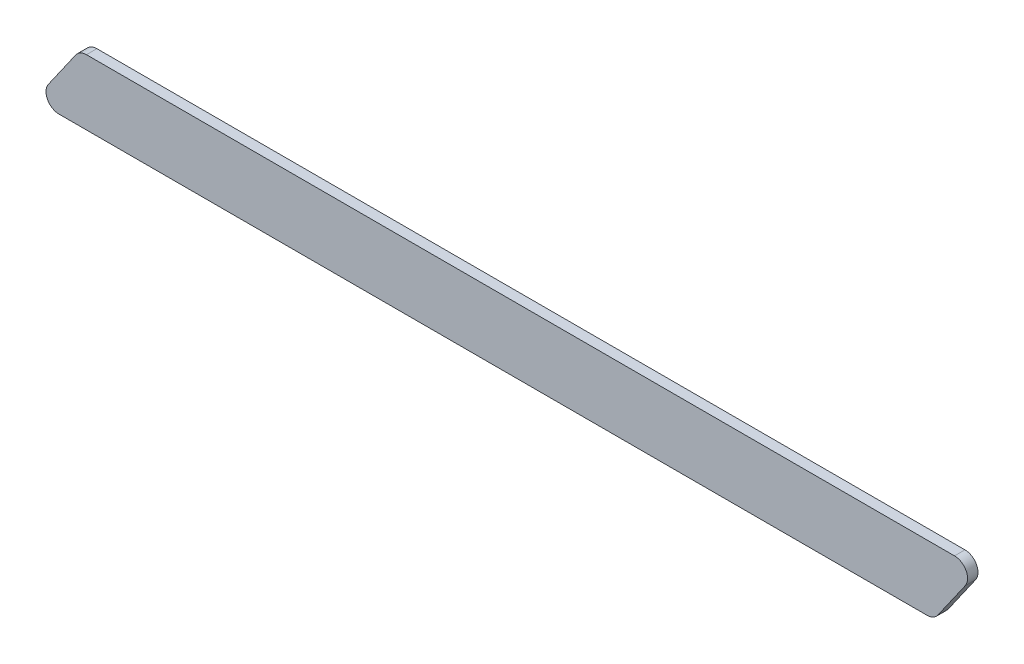
ISO-10303-21;
HEADER;
FILE_DESCRIPTION(('STEP AP214'),'2;1');
FILE_NAME('part.step','',(''),(''),'','','');
FILE_SCHEMA(('AUTOMOTIVE_DESIGN { 1 0 10303 214 1 1 1 1 }'));
ENDSEC;
DATA;
#1=APPLICATION_CONTEXT('core data for automotive mechanical design processes');
#2=APPLICATION_PROTOCOL_DEFINITION('international standard','automotive_design',2000,#1);
#3=PRODUCT_CONTEXT('',#1,'mechanical');
#4=PRODUCT('Part','Part','',(#3));
#5=PRODUCT_RELATED_PRODUCT_CATEGORY('part','',(#4));
#6=PRODUCT_DEFINITION_FORMATION('','',#4);
#7=PRODUCT_DEFINITION_CONTEXT('part definition',#1,'design');
#8=PRODUCT_DEFINITION('design','',#6,#7);
#9=PRODUCT_DEFINITION_SHAPE('','',#8);
#10=(LENGTH_UNIT() NAMED_UNIT(*) SI_UNIT(.MILLI.,.METRE.));
#11=(NAMED_UNIT(*) PLANE_ANGLE_UNIT() SI_UNIT($,.RADIAN.));
#12=(NAMED_UNIT(*) SI_UNIT($,.STERADIAN.) SOLID_ANGLE_UNIT());
#13=UNCERTAINTY_MEASURE_WITH_UNIT(LENGTH_MEASURE(1.E-05),#10,'distance_accuracy_value','');
#14=(GEOMETRIC_REPRESENTATION_CONTEXT(3) GLOBAL_UNCERTAINTY_ASSIGNED_CONTEXT((#13)) GLOBAL_UNIT_ASSIGNED_CONTEXT((#10,
#11,#12)) REPRESENTATION_CONTEXT('',''));
#15=CARTESIAN_POINT('',(0.,0.,0.));
#16=DIRECTION('',(0.,0.,1.));
#17=DIRECTION('',(1.,0.,0.));
#18=AXIS2_PLACEMENT_3D('',#15,#16,#17);
#19=CARTESIAN_POINT('',(-72.5,5.,1.6));
#20=DIRECTION('',(0.,-1.,0.));
#21=DIRECTION('',(0.,0.,-1.));
#22=AXIS2_PLACEMENT_3D('',#19,#20,#21);
#23=PLANE('',#22);
#24=DIRECTION('',(-1.,0.,0.));
#25=VECTOR('',#24,1.);
#26=CARTESIAN_POINT('',(-72.5,5.,1.6));
#27=LINE('',#26,#25);
#28=CARTESIAN_POINT('',(68.6586888768532,5.,1.6));
#29=VERTEX_POINT('',#28);
#30=CARTESIAN_POINT('',(-64.4586888768532,5.,1.6));
#31=VERTEX_POINT('',#30);
#32=EDGE_CURVE('E134',#29,#31,#27,.T.);
#33=ORIENTED_EDGE('',*,*,#32,.F.);
#34=DIRECTION('',(0.,0.,-1.));
#35=VECTOR('',#34,1.);
#36=CARTESIAN_POINT('',(68.6586888768532,5.,1.6));
#37=LINE('',#36,#35);
#38=CARTESIAN_POINT('',(68.6586888768532,5.,0.));
#39=VERTEX_POINT('',#38);
#40=EDGE_CURVE('E117',#29,#39,#37,.T.);
#41=ORIENTED_EDGE('',*,*,#40,.T.);
#42=DIRECTION('',(-1.,0.,0.));
#43=VECTOR('',#42,1.);
#44=CARTESIAN_POINT('',(-72.5,5.,0.));
#45=LINE('',#44,#43);
#46=CARTESIAN_POINT('',(-64.4586888768532,5.,0.));
#47=VERTEX_POINT('',#46);
#48=EDGE_CURVE('E131',#39,#47,#45,.T.);
#49=ORIENTED_EDGE('',*,*,#48,.T.);
#50=DIRECTION('',(0.,0.,1.));
#51=VECTOR('',#50,1.);
#52=CARTESIAN_POINT('',(-64.4586888768532,5.,1.6));
#53=LINE('',#52,#51);
#54=EDGE_CURVE('E137',#47,#31,#53,.T.);
#55=ORIENTED_EDGE('',*,*,#54,.T.);
#56=EDGE_LOOP('',(#33,#41,#49,#55));
#57=FACE_BOUND('',#56,.T.);
#58=ADVANCED_FACE('F45',(#57),#23,.F.);
#59=CARTESIAN_POINT('',(-72.5,-5.,1.6));
#60=DIRECTION('',(0.,1.,0.));
#61=DIRECTION('',(0.,0.,1.));
#62=AXIS2_PLACEMENT_3D('',#59,#60,#61);
#63=PLANE('',#62);
#64=DIRECTION('',(1.,0.,0.));
#65=VECTOR('',#64,1.);
#66=CARTESIAN_POINT('',(-72.5,-5.,0.));
#67=LINE('',#66,#65);
#68=CARTESIAN_POINT('',(-68.6586888768532,-5.,0.));
#69=VERTEX_POINT('',#68);
#70=CARTESIAN_POINT('',(64.4586888768532,-5.,0.));
#71=VERTEX_POINT('',#70);
#72=EDGE_CURVE('E143',#69,#71,#67,.T.);
#73=ORIENTED_EDGE('',*,*,#72,.T.);
#74=DIRECTION('',(0.,0.,1.));
#75=VECTOR('',#74,1.);
#76=CARTESIAN_POINT('',(64.4586888768532,-5.,1.6));
#77=LINE('',#76,#75);
#78=CARTESIAN_POINT('',(64.4586888768532,-5.,1.6));
#79=VERTEX_POINT('',#78);
#80=EDGE_CURVE('E183',#71,#79,#77,.T.);
#81=ORIENTED_EDGE('',*,*,#80,.T.);
#82=DIRECTION('',(1.,0.,0.));
#83=VECTOR('',#82,1.);
#84=CARTESIAN_POINT('',(-72.5,-5.,1.6));
#85=LINE('',#84,#83);
#86=CARTESIAN_POINT('',(-68.6586888768532,-5.,1.6));
#87=VERTEX_POINT('',#86);
#88=EDGE_CURVE('E153',#87,#79,#85,.T.);
#89=ORIENTED_EDGE('',*,*,#88,.F.);
#90=DIRECTION('',(0.,0.,-1.));
#91=VECTOR('',#90,1.);
#92=CARTESIAN_POINT('',(-68.6586888768532,-5.,1.6));
#93=LINE('',#92,#91);
#94=EDGE_CURVE('E179',#87,#69,#93,.T.);
#95=ORIENTED_EDGE('',*,*,#94,.T.);
#96=EDGE_LOOP('',(#73,#81,#89,#95));
#97=FACE_BOUND('',#96,.T.);
#98=ADVANCED_FACE('F212',(#97),#63,.F.);
#99=CARTESIAN_POINT('',(0.,0.,1.6));
#100=DIRECTION('',(0.,0.,-1.));
#101=DIRECTION('',(-1.,0.,0.));
#102=AXIS2_PLACEMENT_3D('',#99,#100,#101);
#103=PLANE('',#102);
#104=DIRECTION('',(-0.573462344363329,-0.81923192051904,0.));
#105=VECTOR('',#104,1.);
#106=CARTESIAN_POINT('',(72.5,5.,1.6));
#107=LINE('',#106,#105);
#108=CARTESIAN_POINT('',(70.2971527178913,1.85307531127334,1.6));
#109=VERTEX_POINT('',#108);
#110=CARTESIAN_POINT('',(66.0971527178913,-4.14692468872667,1.6));
#111=VERTEX_POINT('',#110);
#112=EDGE_CURVE('E202',#109,#111,#107,.T.);
#113=ORIENTED_EDGE('',*,*,#112,.F.);
#114=CARTESIAN_POINT('',(68.6586888768532,3.,1.6));
#115=DIRECTION('',(0.,0.,-1.));
#116=DIRECTION('',(-1.,0.,0.));
#117=AXIS2_PLACEMENT_3D('',#114,#115,#116);
#118=CIRCLE('',#117,2.);
#119=EDGE_CURVE('E176',#109,#29,#118,.F.);
#120=ORIENTED_EDGE('',*,*,#119,.T.);
#121=ORIENTED_EDGE('',*,*,#32,.T.);
#122=CARTESIAN_POINT('',(-64.4586888768532,3.,1.6));
#123=DIRECTION('',(0.,0.,-1.));
#124=DIRECTION('',(-1.,0.,0.));
#125=AXIS2_PLACEMENT_3D('',#122,#123,#124);
#126=CIRCLE('',#125,2.);
#127=CARTESIAN_POINT('',(-66.0971527178913,4.14692468872666,1.6));
#128=VERTEX_POINT('',#127);
#129=EDGE_CURVE('E169',#31,#128,#126,.F.);
#130=ORIENTED_EDGE('',*,*,#129,.T.);
#131=DIRECTION('',(0.573462344363329,0.81923192051904,0.));
#132=VECTOR('',#131,1.);
#133=CARTESIAN_POINT('',(-72.5,-5.,1.6));
#134=LINE('',#133,#132);
#135=CARTESIAN_POINT('',(-70.2971527178913,-1.85307531127334,1.6));
#136=VERTEX_POINT('',#135);
#137=EDGE_CURVE('E150',#136,#128,#134,.T.);
#138=ORIENTED_EDGE('',*,*,#137,.F.);
#139=CARTESIAN_POINT('',(-68.6586888768532,-3.,1.6));
#140=DIRECTION('',(0.,0.,-1.));
#141=DIRECTION('',(-1.,0.,0.));
#142=AXIS2_PLACEMENT_3D('',#139,#140,#141);
#143=CIRCLE('',#142,2.);
#144=EDGE_CURVE('E69',#136,#87,#143,.F.);
#145=ORIENTED_EDGE('',*,*,#144,.T.);
#146=ORIENTED_EDGE('',*,*,#88,.T.);
#147=CARTESIAN_POINT('',(64.4586888768532,-3.,1.6));
#148=DIRECTION('',(0.,0.,-1.));
#149=DIRECTION('',(-1.,0.,0.));
#150=AXIS2_PLACEMENT_3D('',#147,#148,#149);
#151=CIRCLE('',#150,2.);
#152=EDGE_CURVE('E61',#79,#111,#151,.F.);
#153=ORIENTED_EDGE('',*,*,#152,.T.);
#154=EDGE_LOOP('',(#113,#120,#121,#130,#138,#145,#146,#153));
#155=FACE_BOUND('',#154,.T.);
#156=ADVANCED_FACE('F195',(#155),#103,.F.);
#157=CARTESIAN_POINT('',(0.,0.,0.));
#158=DIRECTION('',(0.,0.,-1.));
#159=DIRECTION('',(-1.,0.,0.));
#160=AXIS2_PLACEMENT_3D('',#157,#158,#159);
#161=PLANE('',#160);
#162=ORIENTED_EDGE('',*,*,#48,.F.);
#163=CARTESIAN_POINT('',(68.6586888768532,3.,0.));
#164=DIRECTION('',(0.,0.,-1.));
#165=DIRECTION('',(-1.,0.,0.));
#166=AXIS2_PLACEMENT_3D('',#163,#164,#165);
#167=CIRCLE('',#166,2.);
#168=CARTESIAN_POINT('',(70.2971527178913,1.85307531127334,0.));
#169=VERTEX_POINT('',#168);
#170=EDGE_CURVE('E113',#39,#169,#167,.T.);
#171=ORIENTED_EDGE('',*,*,#170,.T.);
#172=DIRECTION('',(-0.573462344363329,-0.81923192051904,0.));
#173=VECTOR('',#172,1.);
#174=CARTESIAN_POINT('',(72.5,5.,0.));
#175=LINE('',#174,#173);
#176=CARTESIAN_POINT('',(66.0971527178913,-4.14692468872667,0.));
#177=VERTEX_POINT('',#176);
#178=EDGE_CURVE('E199',#169,#177,#175,.T.);
#179=ORIENTED_EDGE('',*,*,#178,.T.);
#180=CARTESIAN_POINT('',(64.4586888768532,-3.,0.));
#181=DIRECTION('',(0.,0.,-1.));
#182=DIRECTION('',(-1.,0.,0.));
#183=AXIS2_PLACEMENT_3D('',#180,#181,#182);
#184=CIRCLE('',#183,2.);
#185=EDGE_CURVE('E125',#177,#71,#184,.T.);
#186=ORIENTED_EDGE('',*,*,#185,.T.);
#187=ORIENTED_EDGE('',*,*,#72,.F.);
#188=CARTESIAN_POINT('',(-68.6586888768532,-3.,0.));
#189=DIRECTION('',(0.,0.,-1.));
#190=DIRECTION('',(-1.,0.,0.));
#191=AXIS2_PLACEMENT_3D('',#188,#189,#190);
#192=CIRCLE('',#191,2.);
#193=CARTESIAN_POINT('',(-70.2971527178913,-1.85307531127334,0.));
#194=VERTEX_POINT('',#193);
#195=EDGE_CURVE('E160',#69,#194,#192,.T.);
#196=ORIENTED_EDGE('',*,*,#195,.T.);
#197=DIRECTION('',(0.573462344363329,0.81923192051904,0.));
#198=VECTOR('',#197,1.);
#199=CARTESIAN_POINT('',(-72.5,-5.,0.));
#200=LINE('',#199,#198);
#201=CARTESIAN_POINT('',(-66.0971527178913,4.14692468872666,0.));
#202=VERTEX_POINT('',#201);
#203=EDGE_CURVE('E144',#194,#202,#200,.T.);
#204=ORIENTED_EDGE('',*,*,#203,.T.);
#205=CARTESIAN_POINT('',(-64.4586888768532,3.,0.));
#206=DIRECTION('',(0.,0.,-1.));
#207=DIRECTION('',(-1.,0.,0.));
#208=AXIS2_PLACEMENT_3D('',#205,#206,#207);
#209=CIRCLE('',#208,2.);
#210=EDGE_CURVE('E136',#202,#47,#209,.T.);
#211=ORIENTED_EDGE('',*,*,#210,.T.);
#212=EDGE_LOOP('',(#162,#171,#179,#186,#187,#196,#204,#211));
#213=FACE_BOUND('',#212,.T.);
#214=ADVANCED_FACE('F139',(#213),#161,.T.);
#215=CARTESIAN_POINT('',(72.5,5.,0.));
#216=DIRECTION('',(-0.81923192051904,0.573462344363329,0.));
#217=DIRECTION('',(-0.573462344363329,-0.81923192051904,0.));
#218=AXIS2_PLACEMENT_3D('',#215,#216,#217);
#219=PLANE('',#218);
#220=ORIENTED_EDGE('',*,*,#178,.F.);
#221=DIRECTION('',(0.,0.,-1.));
#222=VECTOR('',#221,1.);
#223=CARTESIAN_POINT('',(70.2971527178913,1.85307531127334,0.));
#224=LINE('',#223,#222);
#225=EDGE_CURVE('E118',#169,#109,#224,.F.);
#226=ORIENTED_EDGE('',*,*,#225,.T.);
#227=ORIENTED_EDGE('',*,*,#112,.T.);
#228=DIRECTION('',(0.,0.,1.));
#229=VECTOR('',#228,1.);
#230=CARTESIAN_POINT('',(66.0971527178913,-4.14692468872667,0.));
#231=LINE('',#230,#229);
#232=EDGE_CURVE('E124',#111,#177,#231,.F.);
#233=ORIENTED_EDGE('',*,*,#232,.T.);
#234=EDGE_LOOP('',(#220,#226,#227,#233));
#235=FACE_BOUND('',#234,.T.);
#236=ADVANCED_FACE('F208',(#235),#219,.F.);
#237=CARTESIAN_POINT('',(-72.5,-5.,0.));
#238=DIRECTION('',(0.81923192051904,-0.573462344363329,0.));
#239=DIRECTION('',(0.573462344363329,0.81923192051904,0.));
#240=AXIS2_PLACEMENT_3D('',#237,#238,#239);
#241=PLANE('',#240);
#242=ORIENTED_EDGE('',*,*,#203,.F.);
#243=DIRECTION('',(0.,0.,-1.));
#244=VECTOR('',#243,1.);
#245=CARTESIAN_POINT('',(-70.2971527178913,-1.85307531127334,0.));
#246=LINE('',#245,#244);
#247=EDGE_CURVE('E12',#194,#136,#246,.F.);
#248=ORIENTED_EDGE('',*,*,#247,.T.);
#249=ORIENTED_EDGE('',*,*,#137,.T.);
#250=DIRECTION('',(0.,0.,1.));
#251=VECTOR('',#250,1.);
#252=CARTESIAN_POINT('',(-66.0971527178913,4.14692468872666,0.));
#253=LINE('',#252,#251);
#254=EDGE_CURVE('E54',#128,#202,#253,.F.);
#255=ORIENTED_EDGE('',*,*,#254,.T.);
#256=EDGE_LOOP('',(#242,#248,#249,#255));
#257=FACE_BOUND('',#256,.T.);
#258=ADVANCED_FACE('F190',(#257),#241,.F.);
#259=CARTESIAN_POINT('',(68.6586888768532,3.,1.6));
#260=DIRECTION('',(0.,0.,-1.));
#261=DIRECTION('',(-1.,0.,0.));
#262=AXIS2_PLACEMENT_3D('',#259,#260,#261);
#263=CYLINDRICAL_SURFACE('',#262,2.);
#264=ORIENTED_EDGE('',*,*,#119,.F.);
#265=ORIENTED_EDGE('',*,*,#225,.F.);
#266=ORIENTED_EDGE('',*,*,#170,.F.);
#267=ORIENTED_EDGE('',*,*,#40,.F.);
#268=EDGE_LOOP('',(#264,#265,#266,#267));
#269=FACE_BOUND('',#268,.T.);
#270=ADVANCED_FACE('F116',(#269),#263,.T.);
#271=CARTESIAN_POINT('',(64.4586888768532,-3.,1.6));
#272=DIRECTION('',(0.,0.,1.));
#273=DIRECTION('',(1.,0.,0.));
#274=AXIS2_PLACEMENT_3D('',#271,#272,#273);
#275=CYLINDRICAL_SURFACE('',#274,2.);
#276=ORIENTED_EDGE('',*,*,#185,.F.);
#277=ORIENTED_EDGE('',*,*,#232,.F.);
#278=ORIENTED_EDGE('',*,*,#152,.F.);
#279=ORIENTED_EDGE('',*,*,#80,.F.);
#280=EDGE_LOOP('',(#276,#277,#278,#279));
#281=FACE_BOUND('',#280,.T.);
#282=ADVANCED_FACE('F210',(#281),#275,.T.);
#283=CARTESIAN_POINT('',(-68.6586888768532,-3.,1.6));
#284=DIRECTION('',(0.,0.,-1.));
#285=DIRECTION('',(-1.,0.,0.));
#286=AXIS2_PLACEMENT_3D('',#283,#284,#285);
#287=CYLINDRICAL_SURFACE('',#286,2.);
#288=ORIENTED_EDGE('',*,*,#144,.F.);
#289=ORIENTED_EDGE('',*,*,#247,.F.);
#290=ORIENTED_EDGE('',*,*,#195,.F.);
#291=ORIENTED_EDGE('',*,*,#94,.F.);
#292=EDGE_LOOP('',(#288,#289,#290,#291));
#293=FACE_BOUND('',#292,.T.);
#294=ADVANCED_FACE('F215',(#293),#287,.T.);
#295=CARTESIAN_POINT('',(-64.4586888768532,3.,1.6));
#296=DIRECTION('',(0.,0.,1.));
#297=DIRECTION('',(1.,0.,0.));
#298=AXIS2_PLACEMENT_3D('',#295,#296,#297);
#299=CYLINDRICAL_SURFACE('',#298,2.);
#300=ORIENTED_EDGE('',*,*,#210,.F.);
#301=ORIENTED_EDGE('',*,*,#254,.F.);
#302=ORIENTED_EDGE('',*,*,#129,.F.);
#303=ORIENTED_EDGE('',*,*,#54,.F.);
#304=EDGE_LOOP('',(#300,#301,#302,#303));
#305=FACE_BOUND('',#304,.T.);
#306=ADVANCED_FACE('F47',(#305),#299,.T.);
#307=CLOSED_SHELL('',(#58,#98,#156,#214,#236,#258,#270,#282,#294,#306));
#308=MANIFOLD_SOLID_BREP('B2',#307);
#309=ADVANCED_BREP_SHAPE_REPRESENTATION('',(#18,#308),#14);
#310=SHAPE_DEFINITION_REPRESENTATION(#9,#309);
ENDSEC;
END-ISO-10303-21;
